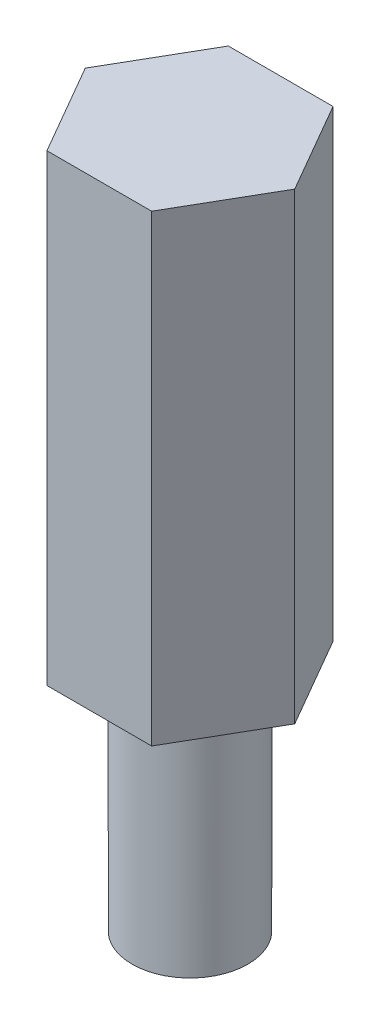
ISO-10303-21;
HEADER;
FILE_DESCRIPTION(('STEP AP214'),'2;1');
FILE_NAME('part.step','',(''),(''),'','','');
FILE_SCHEMA(('AUTOMOTIVE_DESIGN { 1 0 10303 214 1 1 1 1 }'));
ENDSEC;
DATA;
#1=APPLICATION_CONTEXT('core data for automotive mechanical design processes');
#2=APPLICATION_PROTOCOL_DEFINITION('international standard','automotive_design',2000,#1);
#3=PRODUCT_CONTEXT('',#1,'mechanical');
#4=PRODUCT('Part','Part','',(#3));
#5=PRODUCT_RELATED_PRODUCT_CATEGORY('part','',(#4));
#6=PRODUCT_DEFINITION_FORMATION('','',#4);
#7=PRODUCT_DEFINITION_CONTEXT('part definition',#1,'design');
#8=PRODUCT_DEFINITION('design','',#6,#7);
#9=PRODUCT_DEFINITION_SHAPE('','',#8);
#10=(LENGTH_UNIT() NAMED_UNIT(*) SI_UNIT(.MILLI.,.METRE.));
#11=(NAMED_UNIT(*) PLANE_ANGLE_UNIT() SI_UNIT($,.RADIAN.));
#12=(NAMED_UNIT(*) SI_UNIT($,.STERADIAN.) SOLID_ANGLE_UNIT());
#13=UNCERTAINTY_MEASURE_WITH_UNIT(LENGTH_MEASURE(1.E-05),#10,'distance_accuracy_value','');
#14=(GEOMETRIC_REPRESENTATION_CONTEXT(3) GLOBAL_UNCERTAINTY_ASSIGNED_CONTEXT((#13)) GLOBAL_UNIT_ASSIGNED_CONTEXT((#10,
#11,#12)) REPRESENTATION_CONTEXT('',''));
#15=CARTESIAN_POINT('',(0.,0.,0.));
#16=DIRECTION('',(0.,0.,1.));
#17=DIRECTION('',(1.,0.,0.));
#18=AXIS2_PLACEMENT_3D('',#15,#16,#17);
#19=CARTESIAN_POINT('',(1.35677313259562,12.,-2.35));
#20=DIRECTION('',(0.,0.,1.));
#21=DIRECTION('',(1.,0.,0.));
#22=AXIS2_PLACEMENT_3D('',#19,#20,#21);
#23=PLANE('',#22);
#24=DIRECTION('',(-1.,0.,0.));
#25=VECTOR('',#24,1.);
#26=CARTESIAN_POINT('',(1.35677313259562,0.,-2.35));
#27=LINE('',#26,#25);
#28=CARTESIAN_POINT('',(1.35677313259562,0.,-2.35));
#29=VERTEX_POINT('',#28);
#30=CARTESIAN_POINT('',(-1.35677313259562,0.,-2.35));
#31=VERTEX_POINT('',#30);
#32=EDGE_CURVE('E119',#29,#31,#27,.T.);
#33=ORIENTED_EDGE('',*,*,#32,.T.);
#34=DIRECTION('',(0.,-1.,0.));
#35=VECTOR('',#34,1.);
#36=CARTESIAN_POINT('',(-1.35677313259562,12.,-2.35));
#37=LINE('',#36,#35);
#38=CARTESIAN_POINT('',(-1.35677313259562,12.,-2.35));
#39=VERTEX_POINT('',#38);
#40=EDGE_CURVE('E42',#39,#31,#37,.T.);
#41=ORIENTED_EDGE('',*,*,#40,.F.);
#42=DIRECTION('',(-1.,0.,0.));
#43=VECTOR('',#42,1.);
#44=CARTESIAN_POINT('',(1.35677313259562,12.,-2.35));
#45=LINE('',#44,#43);
#46=CARTESIAN_POINT('',(1.35677313259562,12.,-2.35));
#47=VERTEX_POINT('',#46);
#48=EDGE_CURVE('E130',#47,#39,#45,.T.);
#49=ORIENTED_EDGE('',*,*,#48,.F.);
#50=DIRECTION('',(0.,-1.,0.));
#51=VECTOR('',#50,1.);
#52=CARTESIAN_POINT('',(1.35677313259562,12.,-2.35));
#53=LINE('',#52,#51);
#54=EDGE_CURVE('E115',#47,#29,#53,.T.);
#55=ORIENTED_EDGE('',*,*,#54,.T.);
#56=EDGE_LOOP('',(#33,#41,#49,#55));
#57=FACE_BOUND('',#56,.T.);
#58=ADVANCED_FACE('F34',(#57),#23,.F.);
#59=CARTESIAN_POINT('',(-1.35677313259562,12.,-2.35));
#60=DIRECTION('',(0.866025403784439,0.,0.5));
#61=DIRECTION('',(0.5,0.,-0.866025403784439));
#62=AXIS2_PLACEMENT_3D('',#59,#60,#61);
#63=PLANE('',#62);
#64=DIRECTION('',(-0.5,0.,0.866025403784439));
#65=VECTOR('',#64,1.);
#66=CARTESIAN_POINT('',(-1.35677313259562,0.,-2.35));
#67=LINE('',#66,#65);
#68=CARTESIAN_POINT('',(-2.71354626519124,0.,0.));
#69=VERTEX_POINT('',#68);
#70=EDGE_CURVE('E122',#31,#69,#67,.T.);
#71=ORIENTED_EDGE('',*,*,#70,.T.);
#72=DIRECTION('',(0.,-1.,0.));
#73=VECTOR('',#72,1.);
#74=CARTESIAN_POINT('',(-2.71354626519124,12.,0.));
#75=LINE('',#74,#73);
#76=CARTESIAN_POINT('',(-2.71354626519124,12.,0.));
#77=VERTEX_POINT('',#76);
#78=EDGE_CURVE('E134',#77,#69,#75,.T.);
#79=ORIENTED_EDGE('',*,*,#78,.F.);
#80=DIRECTION('',(-0.5,0.,0.866025403784439));
#81=VECTOR('',#80,1.);
#82=CARTESIAN_POINT('',(-1.35677313259562,12.,-2.35));
#83=LINE('',#82,#81);
#84=EDGE_CURVE('E88',#39,#77,#83,.T.);
#85=ORIENTED_EDGE('',*,*,#84,.F.);
#86=ORIENTED_EDGE('',*,*,#40,.T.);
#87=EDGE_LOOP('',(#71,#79,#85,#86));
#88=FACE_BOUND('',#87,.T.);
#89=ADVANCED_FACE('F137',(#88),#63,.F.);
#90=CARTESIAN_POINT('',(-2.71354626519124,12.,0.));
#91=DIRECTION('',(0.866025403784438,0.,-0.5));
#92=DIRECTION('',(-0.5,0.,-0.866025403784439));
#93=AXIS2_PLACEMENT_3D('',#90,#91,#92);
#94=PLANE('',#93);
#95=DIRECTION('',(0.5,0.,0.866025403784438));
#96=VECTOR('',#95,1.);
#97=CARTESIAN_POINT('',(-2.71354626519124,0.,0.));
#98=LINE('',#97,#96);
#99=CARTESIAN_POINT('',(-1.35677313259562,0.,2.35));
#100=VERTEX_POINT('',#99);
#101=EDGE_CURVE('E125',#69,#100,#98,.T.);
#102=ORIENTED_EDGE('',*,*,#101,.T.);
#103=DIRECTION('',(0.,-1.,0.));
#104=VECTOR('',#103,1.);
#105=CARTESIAN_POINT('',(-1.35677313259562,12.,2.35));
#106=LINE('',#105,#104);
#107=CARTESIAN_POINT('',(-1.35677313259562,12.,2.35));
#108=VERTEX_POINT('',#107);
#109=EDGE_CURVE('E110',#108,#100,#106,.T.);
#110=ORIENTED_EDGE('',*,*,#109,.F.);
#111=DIRECTION('',(0.5,0.,0.866025403784438));
#112=VECTOR('',#111,1.);
#113=CARTESIAN_POINT('',(-2.71354626519124,12.,0.));
#114=LINE('',#113,#112);
#115=EDGE_CURVE('E101',#77,#108,#114,.T.);
#116=ORIENTED_EDGE('',*,*,#115,.F.);
#117=ORIENTED_EDGE('',*,*,#78,.T.);
#118=EDGE_LOOP('',(#102,#110,#116,#117));
#119=FACE_BOUND('',#118,.T.);
#120=ADVANCED_FACE('F145',(#119),#94,.F.);
#121=CARTESIAN_POINT('',(-1.35677313259562,12.,2.35));
#122=DIRECTION('',(0.,0.,-1.));
#123=DIRECTION('',(-1.,0.,0.));
#124=AXIS2_PLACEMENT_3D('',#121,#122,#123);
#125=PLANE('',#124);
#126=DIRECTION('',(1.,0.,0.));
#127=VECTOR('',#126,1.);
#128=CARTESIAN_POINT('',(-1.35677313259562,0.,2.35));
#129=LINE('',#128,#127);
#130=CARTESIAN_POINT('',(1.35677313259562,0.,2.35));
#131=VERTEX_POINT('',#130);
#132=EDGE_CURVE('E109',#100,#131,#129,.T.);
#133=ORIENTED_EDGE('',*,*,#132,.T.);
#134=DIRECTION('',(0.,-1.,0.));
#135=VECTOR('',#134,1.);
#136=CARTESIAN_POINT('',(1.35677313259562,12.,2.35));
#137=LINE('',#136,#135);
#138=CARTESIAN_POINT('',(1.35677313259562,12.,2.35));
#139=VERTEX_POINT('',#138);
#140=EDGE_CURVE('E106',#139,#131,#137,.T.);
#141=ORIENTED_EDGE('',*,*,#140,.F.);
#142=DIRECTION('',(1.,0.,0.));
#143=VECTOR('',#142,1.);
#144=CARTESIAN_POINT('',(-1.35677313259562,12.,2.35));
#145=LINE('',#144,#143);
#146=EDGE_CURVE('E95',#108,#139,#145,.T.);
#147=ORIENTED_EDGE('',*,*,#146,.F.);
#148=ORIENTED_EDGE('',*,*,#109,.T.);
#149=EDGE_LOOP('',(#133,#141,#147,#148));
#150=FACE_BOUND('',#149,.T.);
#151=ADVANCED_FACE('F107',(#150),#125,.F.);
#152=CARTESIAN_POINT('',(1.35677313259562,12.,2.35));
#153=DIRECTION('',(-0.866025403784439,0.,-0.5));
#154=DIRECTION('',(-0.5,0.,0.866025403784439));
#155=AXIS2_PLACEMENT_3D('',#152,#153,#154);
#156=PLANE('',#155);
#157=DIRECTION('',(0.5,0.,-0.866025403784439));
#158=VECTOR('',#157,1.);
#159=CARTESIAN_POINT('',(1.35677313259562,0.,2.35));
#160=LINE('',#159,#158);
#161=CARTESIAN_POINT('',(2.71354626519124,0.,0.));
#162=VERTEX_POINT('',#161);
#163=EDGE_CURVE('E73',#131,#162,#160,.T.);
#164=ORIENTED_EDGE('',*,*,#163,.T.);
#165=DIRECTION('',(0.,-1.,0.));
#166=VECTOR('',#165,1.);
#167=CARTESIAN_POINT('',(2.71354626519124,12.,0.));
#168=LINE('',#167,#166);
#169=CARTESIAN_POINT('',(2.71354626519124,12.,0.));
#170=VERTEX_POINT('',#169);
#171=EDGE_CURVE('E111',#170,#162,#168,.T.);
#172=ORIENTED_EDGE('',*,*,#171,.F.);
#173=DIRECTION('',(0.5,0.,-0.866025403784439));
#174=VECTOR('',#173,1.);
#175=CARTESIAN_POINT('',(1.35677313259562,12.,2.35));
#176=LINE('',#175,#174);
#177=EDGE_CURVE('E99',#139,#170,#176,.T.);
#178=ORIENTED_EDGE('',*,*,#177,.F.);
#179=ORIENTED_EDGE('',*,*,#140,.T.);
#180=EDGE_LOOP('',(#164,#172,#178,#179));
#181=FACE_BOUND('',#180,.T.);
#182=ADVANCED_FACE('F113',(#181),#156,.F.);
#183=CARTESIAN_POINT('',(2.71354626519124,12.,0.));
#184=DIRECTION('',(-0.866025403784438,0.,0.5));
#185=DIRECTION('',(0.5,0.,0.866025403784439));
#186=AXIS2_PLACEMENT_3D('',#183,#184,#185);
#187=PLANE('',#186);
#188=DIRECTION('',(-0.5,0.,-0.866025403784439));
#189=VECTOR('',#188,1.);
#190=CARTESIAN_POINT('',(2.71354626519124,0.,0.));
#191=LINE('',#190,#189);
#192=EDGE_CURVE('E79',#162,#29,#191,.T.);
#193=ORIENTED_EDGE('',*,*,#192,.T.);
#194=ORIENTED_EDGE('',*,*,#54,.F.);
#195=DIRECTION('',(-0.5,0.,-0.866025403784439));
#196=VECTOR('',#195,1.);
#197=CARTESIAN_POINT('',(2.71354626519124,12.,0.));
#198=LINE('',#197,#196);
#199=EDGE_CURVE('E50',#170,#47,#198,.T.);
#200=ORIENTED_EDGE('',*,*,#199,.F.);
#201=ORIENTED_EDGE('',*,*,#171,.T.);
#202=EDGE_LOOP('',(#193,#194,#200,#201));
#203=FACE_BOUND('',#202,.T.);
#204=ADVANCED_FACE('F165',(#203),#187,.F.);
#205=CARTESIAN_POINT('',(0.,12.,0.));
#206=DIRECTION('',(0.,1.,0.));
#207=DIRECTION('',(0.,0.,1.));
#208=AXIS2_PLACEMENT_3D('',#205,#206,#207);
#209=PLANE('',#208);
#210=ORIENTED_EDGE('',*,*,#48,.T.);
#211=ORIENTED_EDGE('',*,*,#84,.T.);
#212=ORIENTED_EDGE('',*,*,#115,.T.);
#213=ORIENTED_EDGE('',*,*,#146,.T.);
#214=ORIENTED_EDGE('',*,*,#177,.T.);
#215=ORIENTED_EDGE('',*,*,#199,.T.);
#216=EDGE_LOOP('',(#210,#211,#212,#213,#214,#215));
#217=FACE_BOUND('',#216,.T.);
#218=ADVANCED_FACE('F97',(#217),#209,.T.);
#219=CARTESIAN_POINT('',(0.,0.,0.));
#220=DIRECTION('',(0.,1.,0.));
#221=DIRECTION('',(0.,0.,1.));
#222=AXIS2_PLACEMENT_3D('',#219,#220,#221);
#223=PLANE('',#222);
#224=CARTESIAN_POINT('',(0.,0.,0.));
#225=DIRECTION('',(0.,1.,0.));
#226=DIRECTION('',(0.,0.,1.));
#227=AXIS2_PLACEMENT_3D('',#224,#225,#226);
#228=CIRCLE('',#227,1.5);
#229=CARTESIAN_POINT('',(0.,0.,1.5));
#230=VERTEX_POINT('',#229);
#231=EDGE_CURVE('E11',#230,#230,#228,.F.);
#232=ORIENTED_EDGE('',*,*,#231,.F.);
#233=EDGE_LOOP('',(#232));
#234=FACE_BOUND('',#233,.T.);
#235=ORIENTED_EDGE('',*,*,#32,.F.);
#236=ORIENTED_EDGE('',*,*,#192,.F.);
#237=ORIENTED_EDGE('',*,*,#163,.F.);
#238=ORIENTED_EDGE('',*,*,#132,.F.);
#239=ORIENTED_EDGE('',*,*,#101,.F.);
#240=ORIENTED_EDGE('',*,*,#70,.F.);
#241=EDGE_LOOP('',(#235,#236,#237,#238,#239,#240));
#242=FACE_BOUND('',#241,.T.);
#243=ADVANCED_FACE('F142',(#234,#242),#223,.F.);
#244=CARTESIAN_POINT('',(0.,-6.,0.));
#245=DIRECTION('',(0.,1.,0.));
#246=DIRECTION('',(0.,0.,1.));
#247=AXIS2_PLACEMENT_3D('',#244,#245,#246);
#248=CYLINDRICAL_SURFACE('',#247,1.5);
#249=CARTESIAN_POINT('',(0.,-6.,0.));
#250=DIRECTION('',(0.,-1.,0.));
#251=DIRECTION('',(0.,0.,-1.));
#252=AXIS2_PLACEMENT_3D('',#249,#250,#251);
#253=CIRCLE('',#252,1.5);
#254=CARTESIAN_POINT('',(0.,-6.,-1.5));
#255=VERTEX_POINT('',#254);
#256=EDGE_CURVE('E123',#255,#255,#253,.T.);
#257=ORIENTED_EDGE('',*,*,#256,.F.);
#258=EDGE_LOOP('',(#257));
#259=FACE_BOUND('',#258,.T.);
#260=ORIENTED_EDGE('',*,*,#231,.T.);
#261=EDGE_LOOP('',(#260));
#262=FACE_BOUND('',#261,.T.);
#263=ADVANCED_FACE('F154',(#259,#262),#248,.T.);
#264=CARTESIAN_POINT('',(0.,-6.,0.));
#265=DIRECTION('',(0.,-1.,0.));
#266=DIRECTION('',(0.,0.,-1.));
#267=AXIS2_PLACEMENT_3D('',#264,#265,#266);
#268=PLANE('',#267);
#269=ORIENTED_EDGE('',*,*,#256,.T.);
#270=EDGE_LOOP('',(#269));
#271=FACE_BOUND('',#270,.T.);
#272=ADVANCED_FACE('F152',(#271),#268,.T.);
#273=CLOSED_SHELL('',(#58,#89,#120,#151,#182,#204,#218,#243,#263,#272));
#274=MANIFOLD_SOLID_BREP('B2',#273);
#275=ADVANCED_BREP_SHAPE_REPRESENTATION('',(#18,#274),#14);
#276=SHAPE_DEFINITION_REPRESENTATION(#9,#275);
ENDSEC;
END-ISO-10303-21;
